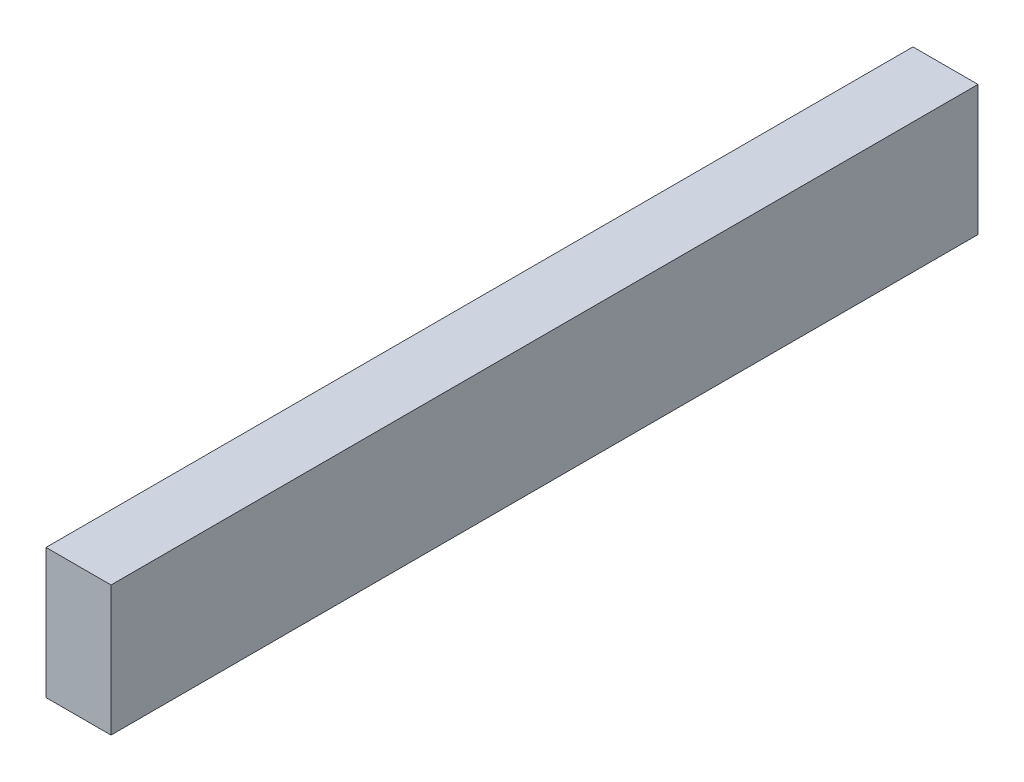
ISO-10303-21;
HEADER;
FILE_DESCRIPTION(('STEP AP214'),'2;1');
FILE_NAME('part.step','',(''),(''),'','','');
FILE_SCHEMA(('AUTOMOTIVE_DESIGN { 1 0 10303 214 1 1 1 1 }'));
ENDSEC;
DATA;
#1=APPLICATION_CONTEXT('core data for automotive mechanical design processes');
#2=APPLICATION_PROTOCOL_DEFINITION('international standard','automotive_design',2000,#1);
#3=PRODUCT_CONTEXT('',#1,'mechanical');
#4=PRODUCT('Part','Part','',(#3));
#5=PRODUCT_RELATED_PRODUCT_CATEGORY('part','',(#4));
#6=PRODUCT_DEFINITION_FORMATION('','',#4);
#7=PRODUCT_DEFINITION_CONTEXT('part definition',#1,'design');
#8=PRODUCT_DEFINITION('design','',#6,#7);
#9=PRODUCT_DEFINITION_SHAPE('','',#8);
#10=(LENGTH_UNIT() NAMED_UNIT(*) SI_UNIT(.MILLI.,.METRE.));
#11=(NAMED_UNIT(*) PLANE_ANGLE_UNIT() SI_UNIT($,.RADIAN.));
#12=(NAMED_UNIT(*) SI_UNIT($,.STERADIAN.) SOLID_ANGLE_UNIT());
#13=UNCERTAINTY_MEASURE_WITH_UNIT(LENGTH_MEASURE(1.E-05),#10,'distance_accuracy_value','');
#14=(GEOMETRIC_REPRESENTATION_CONTEXT(3) GLOBAL_UNCERTAINTY_ASSIGNED_CONTEXT((#13)) GLOBAL_UNIT_ASSIGNED_CONTEXT((#10,
#11,#12)) REPRESENTATION_CONTEXT('',''));
#15=CARTESIAN_POINT('',(0.,0.,0.));
#16=DIRECTION('',(0.,0.,1.));
#17=DIRECTION('',(1.,0.,0.));
#18=AXIS2_PLACEMENT_3D('',#15,#16,#17);
#19=CARTESIAN_POINT('',(15.,-30.,200.));
#20=DIRECTION('',(-1.,0.,0.));
#21=DIRECTION('',(0.,0.,1.));
#22=AXIS2_PLACEMENT_3D('',#19,#20,#21);
#23=PLANE('',#22);
#24=DIRECTION('',(0.,1.,0.));
#25=VECTOR('',#24,1.);
#26=CARTESIAN_POINT('',(15.,-30.,-200.));
#27=LINE('',#26,#25);
#28=CARTESIAN_POINT('',(15.,-30.,-200.));
#29=VERTEX_POINT('',#28);
#30=CARTESIAN_POINT('',(15.,30.,-200.));
#31=VERTEX_POINT('',#30);
#32=EDGE_CURVE('E107',#29,#31,#27,.T.);
#33=ORIENTED_EDGE('',*,*,#32,.T.);
#34=DIRECTION('',(0.,0.,-1.));
#35=VECTOR('',#34,1.);
#36=CARTESIAN_POINT('',(15.,30.,200.));
#37=LINE('',#36,#35);
#38=CARTESIAN_POINT('',(15.,30.,200.));
#39=VERTEX_POINT('',#38);
#40=EDGE_CURVE('E11',#39,#31,#37,.T.);
#41=ORIENTED_EDGE('',*,*,#40,.F.);
#42=DIRECTION('',(0.,1.,0.));
#43=VECTOR('',#42,1.);
#44=CARTESIAN_POINT('',(15.,-30.,200.));
#45=LINE('',#44,#43);
#46=CARTESIAN_POINT('',(15.,-30.,200.));
#47=VERTEX_POINT('',#46);
#48=EDGE_CURVE('E91',#47,#39,#45,.T.);
#49=ORIENTED_EDGE('',*,*,#48,.F.);
#50=DIRECTION('',(0.,0.,-1.));
#51=VECTOR('',#50,1.);
#52=CARTESIAN_POINT('',(15.,-30.,200.));
#53=LINE('',#52,#51);
#54=EDGE_CURVE('E103',#47,#29,#53,.T.);
#55=ORIENTED_EDGE('',*,*,#54,.T.);
#56=EDGE_LOOP('',(#33,#41,#49,#55));
#57=FACE_BOUND('',#56,.T.);
#58=ADVANCED_FACE('F39',(#57),#23,.F.);
#59=CARTESIAN_POINT('',(-15.,30.,200.));
#60=DIRECTION('',(0.,-1.,0.));
#61=DIRECTION('',(0.,0.,-1.));
#62=AXIS2_PLACEMENT_3D('',#59,#60,#61);
#63=PLANE('',#62);
#64=DIRECTION('',(-1.,0.,0.));
#65=VECTOR('',#64,1.);
#66=CARTESIAN_POINT('',(-15.,30.,-200.));
#67=LINE('',#66,#65);
#68=CARTESIAN_POINT('',(-15.,30.,-200.));
#69=VERTEX_POINT('',#68);
#70=EDGE_CURVE('E96',#31,#69,#67,.T.);
#71=ORIENTED_EDGE('',*,*,#70,.T.);
#72=DIRECTION('',(0.,0.,-1.));
#73=VECTOR('',#72,1.);
#74=CARTESIAN_POINT('',(-15.,30.,200.));
#75=LINE('',#74,#73);
#76=CARTESIAN_POINT('',(-15.,30.,200.));
#77=VERTEX_POINT('',#76);
#78=EDGE_CURVE('E48',#77,#69,#75,.T.);
#79=ORIENTED_EDGE('',*,*,#78,.F.);
#80=DIRECTION('',(-1.,0.,0.));
#81=VECTOR('',#80,1.);
#82=CARTESIAN_POINT('',(-15.,30.,200.));
#83=LINE('',#82,#81);
#84=EDGE_CURVE('E86',#39,#77,#83,.T.);
#85=ORIENTED_EDGE('',*,*,#84,.F.);
#86=ORIENTED_EDGE('',*,*,#40,.T.);
#87=EDGE_LOOP('',(#71,#79,#85,#86));
#88=FACE_BOUND('',#87,.T.);
#89=ADVANCED_FACE('F95',(#88),#63,.F.);
#90=CARTESIAN_POINT('',(-15.,-30.,200.));
#91=DIRECTION('',(1.,0.,0.));
#92=DIRECTION('',(0.,0.,-1.));
#93=AXIS2_PLACEMENT_3D('',#90,#91,#92);
#94=PLANE('',#93);
#95=DIRECTION('',(0.,-1.,0.));
#96=VECTOR('',#95,1.);
#97=CARTESIAN_POINT('',(-15.,-30.,-200.));
#98=LINE('',#97,#96);
#99=CARTESIAN_POINT('',(-15.,-30.,-200.));
#100=VERTEX_POINT('',#99);
#101=EDGE_CURVE('E73',#69,#100,#98,.T.);
#102=ORIENTED_EDGE('',*,*,#101,.T.);
#103=DIRECTION('',(0.,0.,-1.));
#104=VECTOR('',#103,1.);
#105=CARTESIAN_POINT('',(-15.,-30.,200.));
#106=LINE('',#105,#104);
#107=CARTESIAN_POINT('',(-15.,-30.,200.));
#108=VERTEX_POINT('',#107);
#109=EDGE_CURVE('E98',#108,#100,#106,.T.);
#110=ORIENTED_EDGE('',*,*,#109,.F.);
#111=DIRECTION('',(0.,-1.,0.));
#112=VECTOR('',#111,1.);
#113=CARTESIAN_POINT('',(-15.,-30.,200.));
#114=LINE('',#113,#112);
#115=EDGE_CURVE('E89',#77,#108,#114,.T.);
#116=ORIENTED_EDGE('',*,*,#115,.F.);
#117=ORIENTED_EDGE('',*,*,#78,.T.);
#118=EDGE_LOOP('',(#102,#110,#116,#117));
#119=FACE_BOUND('',#118,.T.);
#120=ADVANCED_FACE('F99',(#119),#94,.F.);
#121=CARTESIAN_POINT('',(-15.,-30.,200.));
#122=DIRECTION('',(0.,1.,0.));
#123=DIRECTION('',(0.,0.,1.));
#124=AXIS2_PLACEMENT_3D('',#121,#122,#123);
#125=PLANE('',#124);
#126=DIRECTION('',(1.,0.,0.));
#127=VECTOR('',#126,1.);
#128=CARTESIAN_POINT('',(-15.,-30.,-200.));
#129=LINE('',#128,#127);
#130=EDGE_CURVE('E79',#100,#29,#129,.T.);
#131=ORIENTED_EDGE('',*,*,#130,.T.);
#132=ORIENTED_EDGE('',*,*,#54,.F.);
#133=DIRECTION('',(1.,0.,0.));
#134=VECTOR('',#133,1.);
#135=CARTESIAN_POINT('',(-15.,-30.,200.));
#136=LINE('',#135,#134);
#137=EDGE_CURVE('E56',#108,#47,#136,.T.);
#138=ORIENTED_EDGE('',*,*,#137,.F.);
#139=ORIENTED_EDGE('',*,*,#109,.T.);
#140=EDGE_LOOP('',(#131,#132,#138,#139));
#141=FACE_BOUND('',#140,.T.);
#142=ADVANCED_FACE('F120',(#141),#125,.F.);
#143=CARTESIAN_POINT('',(0.,0.,200.));
#144=DIRECTION('',(0.,0.,-1.));
#145=DIRECTION('',(-1.,0.,0.));
#146=AXIS2_PLACEMENT_3D('',#143,#144,#145);
#147=PLANE('',#146);
#148=ORIENTED_EDGE('',*,*,#48,.T.);
#149=ORIENTED_EDGE('',*,*,#84,.T.);
#150=ORIENTED_EDGE('',*,*,#115,.T.);
#151=ORIENTED_EDGE('',*,*,#137,.T.);
#152=EDGE_LOOP('',(#148,#149,#150,#151));
#153=FACE_BOUND('',#152,.T.);
#154=ADVANCED_FACE('F87',(#153),#147,.F.);
#155=CARTESIAN_POINT('',(0.,0.,-200.));
#156=DIRECTION('',(0.,0.,-1.));
#157=DIRECTION('',(-1.,0.,0.));
#158=AXIS2_PLACEMENT_3D('',#155,#156,#157);
#159=PLANE('',#158);
#160=ORIENTED_EDGE('',*,*,#32,.F.);
#161=ORIENTED_EDGE('',*,*,#130,.F.);
#162=ORIENTED_EDGE('',*,*,#101,.F.);
#163=ORIENTED_EDGE('',*,*,#70,.F.);
#164=EDGE_LOOP('',(#160,#161,#162,#163));
#165=FACE_BOUND('',#164,.T.);
#166=ADVANCED_FACE('F123',(#165),#159,.T.);
#167=CLOSED_SHELL('',(#58,#89,#120,#142,#154,#166));
#168=MANIFOLD_SOLID_BREP('B2',#167);
#169=ADVANCED_BREP_SHAPE_REPRESENTATION('',(#18,#168),#14);
#170=SHAPE_DEFINITION_REPRESENTATION(#9,#169);
ENDSEC;
END-ISO-10303-21;
